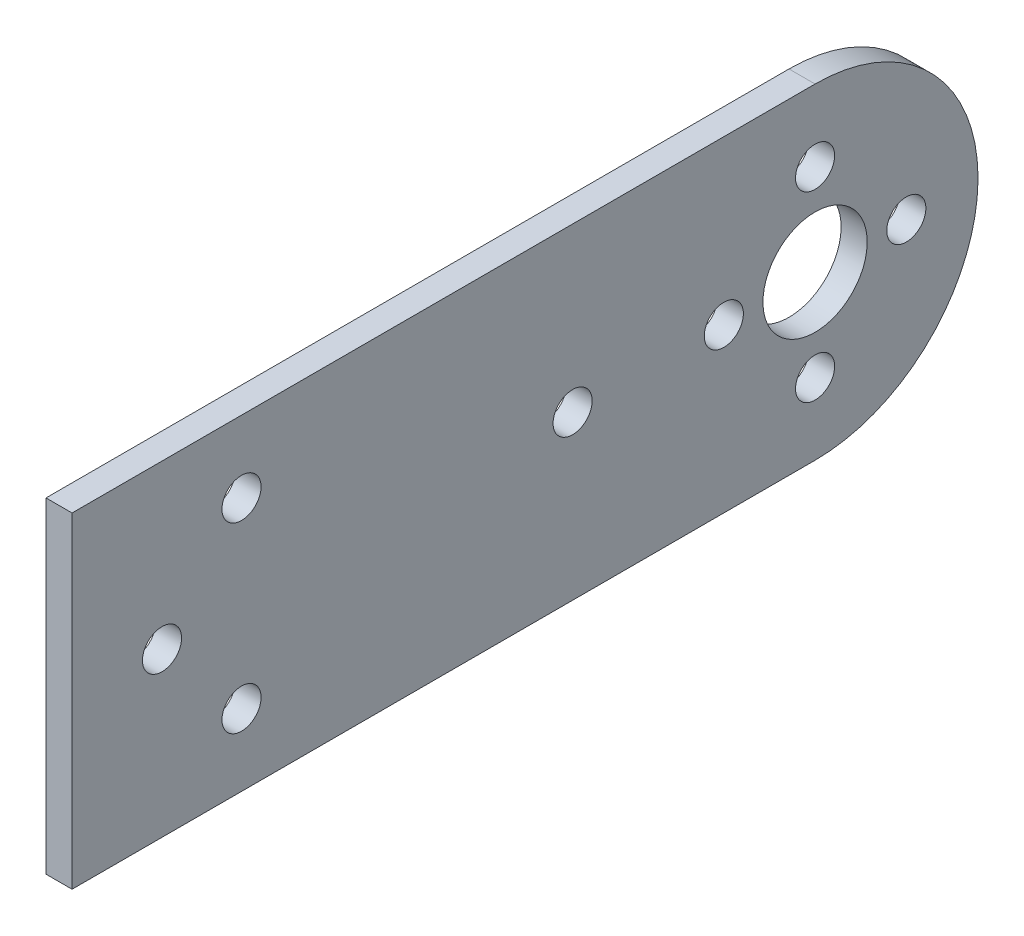
ISO-10303-21;
HEADER;
FILE_DESCRIPTION(('STEP AP214'),'2;1');
FILE_NAME('part.step','',(''),(''),'','','');
FILE_SCHEMA(('AUTOMOTIVE_DESIGN { 1 0 10303 214 1 1 1 1 }'));
ENDSEC;
DATA;
#1=APPLICATION_CONTEXT('core data for automotive mechanical design processes');
#2=APPLICATION_PROTOCOL_DEFINITION('international standard','automotive_design',2000,#1);
#3=PRODUCT_CONTEXT('',#1,'mechanical');
#4=PRODUCT('Part','Part','',(#3));
#5=PRODUCT_RELATED_PRODUCT_CATEGORY('part','',(#4));
#6=PRODUCT_DEFINITION_FORMATION('','',#4);
#7=PRODUCT_DEFINITION_CONTEXT('part definition',#1,'design');
#8=PRODUCT_DEFINITION('design','',#6,#7);
#9=PRODUCT_DEFINITION_SHAPE('','',#8);
#10=(LENGTH_UNIT() NAMED_UNIT(*) SI_UNIT(.MILLI.,.METRE.));
#11=(NAMED_UNIT(*) PLANE_ANGLE_UNIT() SI_UNIT($,.RADIAN.));
#12=(NAMED_UNIT(*) SI_UNIT($,.STERADIAN.) SOLID_ANGLE_UNIT());
#13=UNCERTAINTY_MEASURE_WITH_UNIT(LENGTH_MEASURE(1.E-05),#10,'distance_accuracy_value','');
#14=(GEOMETRIC_REPRESENTATION_CONTEXT(3) GLOBAL_UNCERTAINTY_ASSIGNED_CONTEXT((#13)) GLOBAL_UNIT_ASSIGNED_CONTEXT((#10,
#11,#12)) REPRESENTATION_CONTEXT('',''));
#15=CARTESIAN_POINT('',(0.,0.,0.));
#16=DIRECTION('',(0.,0.,1.));
#17=DIRECTION('',(1.,0.,0.));
#18=AXIS2_PLACEMENT_3D('',#15,#16,#17);
#19=CARTESIAN_POINT('',(0.999999999999999,12.5,69.5));
#20=DIRECTION('',(-1.,0.,0.));
#21=DIRECTION('',(0.,-1.,0.));
#22=AXIS2_PLACEMENT_3D('',#19,#20,#21);
#23=PLANE('',#22);
#24=CARTESIAN_POINT('',(1.,0.,62.6));
#25=DIRECTION('',(1.,0.,0.));
#26=DIRECTION('',(0.,1.,0.));
#27=AXIS2_PLACEMENT_3D('',#24,#25,#26);
#28=CIRCLE('',#27,1.5);
#29=CARTESIAN_POINT('',(1.,1.5,62.6));
#30=VERTEX_POINT('',#29);
#31=EDGE_CURVE('E238',#30,#30,#28,.T.);
#32=ORIENTED_EDGE('',*,*,#31,.F.);
#33=EDGE_LOOP('',(#32));
#34=FACE_BOUND('',#33,.T.);
#35=CARTESIAN_POINT('',(0.999999999999999,6.99999999999999,56.5));
#36=DIRECTION('',(1.,0.,0.));
#37=DIRECTION('',(0.,1.,0.));
#38=AXIS2_PLACEMENT_3D('',#35,#36,#37);
#39=CIRCLE('',#38,1.5);
#40=CARTESIAN_POINT('',(0.999999999999999,8.5,56.5));
#41=VERTEX_POINT('',#40);
#42=EDGE_CURVE('E326',#41,#41,#39,.T.);
#43=ORIENTED_EDGE('',*,*,#42,.F.);
#44=EDGE_LOOP('',(#43));
#45=FACE_BOUND('',#44,.T.);
#46=CARTESIAN_POINT('',(1.,-6.99999999999999,56.5));
#47=DIRECTION('',(1.,0.,0.));
#48=DIRECTION('',(0.,-1.,0.));
#49=AXIS2_PLACEMENT_3D('',#46,#47,#48);
#50=CIRCLE('',#49,1.5);
#51=CARTESIAN_POINT('',(1.,-8.5,56.5));
#52=VERTEX_POINT('',#51);
#53=EDGE_CURVE('E330',#52,#52,#50,.T.);
#54=ORIENTED_EDGE('',*,*,#53,.F.);
#55=EDGE_LOOP('',(#54));
#56=FACE_BOUND('',#55,.T.);
#57=CARTESIAN_POINT('',(1.,-7.,12.4990542607161));
#58=DIRECTION('',(1.,0.,0.));
#59=DIRECTION('',(0.,1.,0.));
#60=AXIS2_PLACEMENT_3D('',#57,#58,#59);
#61=CIRCLE('',#60,1.5);
#62=CARTESIAN_POINT('',(1.,-5.5,12.4990542607161));
#63=VERTEX_POINT('',#62);
#64=EDGE_CURVE('E264',#63,#63,#61,.T.);
#65=ORIENTED_EDGE('',*,*,#64,.F.);
#66=EDGE_LOOP('',(#65));
#67=FACE_BOUND('',#66,.T.);
#68=CARTESIAN_POINT('',(0.999999999999999,7.,12.4990542607161));
#69=DIRECTION('',(1.,0.,0.));
#70=DIRECTION('',(0.,1.,0.));
#71=AXIS2_PLACEMENT_3D('',#68,#69,#70);
#72=CIRCLE('',#71,1.5);
#73=CARTESIAN_POINT('',(0.999999999999999,8.5,12.4990542607161));
#74=VERTEX_POINT('',#73);
#75=EDGE_CURVE('E260',#74,#74,#72,.T.);
#76=ORIENTED_EDGE('',*,*,#75,.F.);
#77=EDGE_LOOP('',(#76));
#78=FACE_BOUND('',#77,.T.);
#79=CARTESIAN_POINT('',(1.,0.,31.0990542607161));
#80=DIRECTION('',(1.,0.,0.));
#81=DIRECTION('',(0.,1.,0.));
#82=AXIS2_PLACEMENT_3D('',#79,#80,#81);
#83=CIRCLE('',#82,1.5);
#84=CARTESIAN_POINT('',(1.,1.5,31.0990542607161));
#85=VERTEX_POINT('',#84);
#86=EDGE_CURVE('E245',#85,#85,#83,.T.);
#87=ORIENTED_EDGE('',*,*,#86,.F.);
#88=EDGE_LOOP('',(#87));
#89=FACE_BOUND('',#88,.T.);
#90=CARTESIAN_POINT('',(1.,0.,12.4990542607161));
#91=DIRECTION('',(1.,0.,0.));
#92=DIRECTION('',(0.,1.,0.));
#93=AXIS2_PLACEMENT_3D('',#90,#91,#92);
#94=CIRCLE('',#93,4.00000000000001);
#95=CARTESIAN_POINT('',(1.,4.00000000000001,12.4990542607161));
#96=VERTEX_POINT('',#95);
#97=EDGE_CURVE('E250',#96,#96,#94,.T.);
#98=ORIENTED_EDGE('',*,*,#97,.F.);
#99=EDGE_LOOP('',(#98));
#100=FACE_BOUND('',#99,.T.);
#101=CARTESIAN_POINT('',(1.,0.,19.4990542607161));
#102=DIRECTION('',(1.,0.,0.));
#103=DIRECTION('',(0.,1.,0.));
#104=AXIS2_PLACEMENT_3D('',#101,#102,#103);
#105=CIRCLE('',#104,1.5);
#106=CARTESIAN_POINT('',(1.,1.5,19.4990542607161));
#107=VERTEX_POINT('',#106);
#108=EDGE_CURVE('E256',#107,#107,#105,.T.);
#109=ORIENTED_EDGE('',*,*,#108,.F.);
#110=EDGE_LOOP('',(#109));
#111=FACE_BOUND('',#110,.T.);
#112=CARTESIAN_POINT('',(1.,0.,5.49905426071607));
#113=DIRECTION('',(1.,0.,0.));
#114=DIRECTION('',(0.,1.,0.));
#115=AXIS2_PLACEMENT_3D('',#112,#113,#114);
#116=CIRCLE('',#115,1.5);
#117=CARTESIAN_POINT('',(1.,1.5,5.49905426071607));
#118=VERTEX_POINT('',#117);
#119=EDGE_CURVE('E171',#118,#118,#116,.T.);
#120=ORIENTED_EDGE('',*,*,#119,.F.);
#121=EDGE_LOOP('',(#120));
#122=FACE_BOUND('',#121,.T.);
#123=CARTESIAN_POINT('',(1.,0.,12.4990542607161));
#124=DIRECTION('',(1.,0.,0.));
#125=DIRECTION('',(0.,1.,0.));
#126=AXIS2_PLACEMENT_3D('',#123,#124,#125);
#127=CIRCLE('',#126,12.5);
#128=CARTESIAN_POINT('',(1.,-12.5,12.4990542607161));
#129=VERTEX_POINT('',#128);
#130=CARTESIAN_POINT('',(1.,-0.153761463558061,0.));
#131=VERTEX_POINT('',#130);
#132=EDGE_CURVE('E162',#129,#131,#127,.T.);
#133=ORIENTED_EDGE('',*,*,#132,.T.);
#134=DIRECTION('',(0.,1.,0.));
#135=VECTOR('',#134,1.);
#136=CARTESIAN_POINT('',(0.999999999999999,12.5,0.));
#137=LINE('',#136,#135);
#138=CARTESIAN_POINT('',(1.,0.153761463558061,0.));
#139=VERTEX_POINT('',#138);
#140=EDGE_CURVE('E233',#131,#139,#137,.T.);
#141=ORIENTED_EDGE('',*,*,#140,.T.);
#142=CARTESIAN_POINT('',(1.,0.,12.4990542607161));
#143=DIRECTION('',(1.,0.,0.));
#144=DIRECTION('',(0.,1.,0.));
#145=AXIS2_PLACEMENT_3D('',#142,#143,#144);
#146=CIRCLE('',#145,12.5);
#147=CARTESIAN_POINT('',(0.999999999999999,12.5,12.4990542607161));
#148=VERTEX_POINT('',#147);
#149=EDGE_CURVE('E134',#139,#148,#146,.T.);
#150=ORIENTED_EDGE('',*,*,#149,.T.);
#151=DIRECTION('',(0.,0.,-1.));
#152=VECTOR('',#151,1.);
#153=CARTESIAN_POINT('',(0.999999999999999,12.5,69.5));
#154=LINE('',#153,#152);
#155=CARTESIAN_POINT('',(0.999999999999999,12.5,69.5));
#156=VERTEX_POINT('',#155);
#157=EDGE_CURVE('E203',#156,#148,#154,.T.);
#158=ORIENTED_EDGE('',*,*,#157,.F.);
#159=DIRECTION('',(0.,1.,0.));
#160=VECTOR('',#159,1.);
#161=CARTESIAN_POINT('',(0.999999999999999,12.5,69.5));
#162=LINE('',#161,#160);
#163=CARTESIAN_POINT('',(1.,-12.5,69.5));
#164=VERTEX_POINT('',#163);
#165=EDGE_CURVE('E186',#164,#156,#162,.T.);
#166=ORIENTED_EDGE('',*,*,#165,.F.);
#167=DIRECTION('',(0.,0.,-1.));
#168=VECTOR('',#167,1.);
#169=CARTESIAN_POINT('',(1.,-12.5,69.5));
#170=LINE('',#169,#168);
#171=EDGE_CURVE('E178',#164,#129,#170,.T.);
#172=ORIENTED_EDGE('',*,*,#171,.T.);
#173=EDGE_LOOP('',(#133,#141,#150,#158,#166,#172));
#174=FACE_BOUND('',#173,.T.);
#175=ADVANCED_FACE('F110',(#34,#45,#56,#67,#78,#89,#100,#111,#122,#174),#23,.F.);
#176=CARTESIAN_POINT('',(-1.,12.5,69.5));
#177=DIRECTION('',(0.,-1.,0.));
#178=DIRECTION('',(0.,0.,-1.));
#179=AXIS2_PLACEMENT_3D('',#176,#177,#178);
#180=PLANE('',#179);
#181=DIRECTION('',(1.,0.,0.));
#182=VECTOR('',#181,1.);
#183=CARTESIAN_POINT('',(-68.5,12.5,12.4990542607161));
#184=LINE('',#183,#182);
#185=CARTESIAN_POINT('',(-1.,12.5,12.4990542607161));
#186=VERTEX_POINT('',#185);
#187=EDGE_CURVE('E273',#186,#148,#184,.T.);
#188=ORIENTED_EDGE('',*,*,#187,.F.);
#189=DIRECTION('',(0.,0.,-1.));
#190=VECTOR('',#189,1.);
#191=CARTESIAN_POINT('',(-1.,12.5,69.5));
#192=LINE('',#191,#190);
#193=CARTESIAN_POINT('',(-1.,12.5,69.5));
#194=VERTEX_POINT('',#193);
#195=EDGE_CURVE('E192',#194,#186,#192,.T.);
#196=ORIENTED_EDGE('',*,*,#195,.F.);
#197=DIRECTION('',(-1.,0.,0.));
#198=VECTOR('',#197,1.);
#199=CARTESIAN_POINT('',(-1.,12.5,69.5));
#200=LINE('',#199,#198);
#201=EDGE_CURVE('E283',#156,#194,#200,.T.);
#202=ORIENTED_EDGE('',*,*,#201,.F.);
#203=ORIENTED_EDGE('',*,*,#157,.T.);
#204=EDGE_LOOP('',(#188,#196,#202,#203));
#205=FACE_BOUND('',#204,.T.);
#206=ADVANCED_FACE('F300',(#205),#180,.F.);
#207=CARTESIAN_POINT('',(-1.,12.5,69.5));
#208=DIRECTION('',(1.,0.,0.));
#209=DIRECTION('',(0.,1.,0.));
#210=AXIS2_PLACEMENT_3D('',#207,#208,#209);
#211=PLANE('',#210);
#212=CARTESIAN_POINT('',(-0.999999999999999,0.,62.6));
#213=DIRECTION('',(1.,0.,0.));
#214=DIRECTION('',(0.,1.,0.));
#215=AXIS2_PLACEMENT_3D('',#212,#213,#214);
#216=CIRCLE('',#215,1.5);
#217=CARTESIAN_POINT('',(-0.999999999999999,1.5,62.6));
#218=VERTEX_POINT('',#217);
#219=EDGE_CURVE('E113',#218,#218,#216,.T.);
#220=ORIENTED_EDGE('',*,*,#219,.T.);
#221=EDGE_LOOP('',(#220));
#222=FACE_BOUND('',#221,.T.);
#223=CARTESIAN_POINT('',(-1.,6.99999999999999,56.5));
#224=DIRECTION('',(1.,0.,0.));
#225=DIRECTION('',(0.,1.,0.));
#226=AXIS2_PLACEMENT_3D('',#223,#224,#225);
#227=CIRCLE('',#226,1.5);
#228=CARTESIAN_POINT('',(-1.,8.5,56.5));
#229=VERTEX_POINT('',#228);
#230=EDGE_CURVE('E237',#229,#229,#227,.T.);
#231=ORIENTED_EDGE('',*,*,#230,.T.);
#232=EDGE_LOOP('',(#231));
#233=FACE_BOUND('',#232,.T.);
#234=CARTESIAN_POINT('',(-0.999999999999999,-6.99999999999999,56.5));
#235=DIRECTION('',(1.,0.,0.));
#236=DIRECTION('',(0.,1.,0.));
#237=AXIS2_PLACEMENT_3D('',#234,#235,#236);
#238=CIRCLE('',#237,1.5);
#239=CARTESIAN_POINT('',(-0.999999999999999,-5.49999999999999,56.5));
#240=VERTEX_POINT('',#239);
#241=EDGE_CURVE('E234',#240,#240,#238,.T.);
#242=ORIENTED_EDGE('',*,*,#241,.T.);
#243=EDGE_LOOP('',(#242));
#244=FACE_BOUND('',#243,.T.);
#245=CARTESIAN_POINT('',(-1.,-7.,12.4990542607161));
#246=DIRECTION('',(1.,0.,0.));
#247=DIRECTION('',(0.,1.,0.));
#248=AXIS2_PLACEMENT_3D('',#245,#246,#247);
#249=CIRCLE('',#248,1.5);
#250=CARTESIAN_POINT('',(-1.,-5.5,12.4990542607161));
#251=VERTEX_POINT('',#250);
#252=EDGE_CURVE('E229',#251,#251,#249,.T.);
#253=ORIENTED_EDGE('',*,*,#252,.T.);
#254=EDGE_LOOP('',(#253));
#255=FACE_BOUND('',#254,.T.);
#256=CARTESIAN_POINT('',(-1.,7.,12.4990542607161));
#257=DIRECTION('',(1.,0.,0.));
#258=DIRECTION('',(0.,1.,0.));
#259=AXIS2_PLACEMENT_3D('',#256,#257,#258);
#260=CIRCLE('',#259,1.5);
#261=CARTESIAN_POINT('',(-1.,8.5,12.4990542607161));
#262=VERTEX_POINT('',#261);
#263=EDGE_CURVE('E225',#262,#262,#260,.T.);
#264=ORIENTED_EDGE('',*,*,#263,.T.);
#265=EDGE_LOOP('',(#264));
#266=FACE_BOUND('',#265,.T.);
#267=CARTESIAN_POINT('',(-1.,0.,31.0990542607161));
#268=DIRECTION('',(1.,0.,0.));
#269=DIRECTION('',(0.,1.,0.));
#270=AXIS2_PLACEMENT_3D('',#267,#268,#269);
#271=CIRCLE('',#270,1.5);
#272=CARTESIAN_POINT('',(-1.,1.5,31.0990542607161));
#273=VERTEX_POINT('',#272);
#274=EDGE_CURVE('E209',#273,#273,#271,.T.);
#275=ORIENTED_EDGE('',*,*,#274,.T.);
#276=EDGE_LOOP('',(#275));
#277=FACE_BOUND('',#276,.T.);
#278=CARTESIAN_POINT('',(-1.,0.,12.4990542607161));
#279=DIRECTION('',(1.,0.,0.));
#280=DIRECTION('',(0.,1.,0.));
#281=AXIS2_PLACEMENT_3D('',#278,#279,#280);
#282=CIRCLE('',#281,4.00000000000001);
#283=CARTESIAN_POINT('',(-1.,4.00000000000001,12.4990542607161));
#284=VERTEX_POINT('',#283);
#285=EDGE_CURVE('E213',#284,#284,#282,.T.);
#286=ORIENTED_EDGE('',*,*,#285,.T.);
#287=EDGE_LOOP('',(#286));
#288=FACE_BOUND('',#287,.T.);
#289=CARTESIAN_POINT('',(-1.,0.,19.4990542607161));
#290=DIRECTION('',(1.,0.,0.));
#291=DIRECTION('',(0.,1.,0.));
#292=AXIS2_PLACEMENT_3D('',#289,#290,#291);
#293=CIRCLE('',#292,1.5);
#294=CARTESIAN_POINT('',(-1.,1.5,19.4990542607161));
#295=VERTEX_POINT('',#294);
#296=EDGE_CURVE('E217',#295,#295,#293,.T.);
#297=ORIENTED_EDGE('',*,*,#296,.T.);
#298=EDGE_LOOP('',(#297));
#299=FACE_BOUND('',#298,.T.);
#300=CARTESIAN_POINT('',(-1.,0.,5.49905426071607));
#301=DIRECTION('',(1.,0.,0.));
#302=DIRECTION('',(0.,1.,0.));
#303=AXIS2_PLACEMENT_3D('',#300,#301,#302);
#304=CIRCLE('',#303,1.5);
#305=CARTESIAN_POINT('',(-1.,1.5,5.49905426071607));
#306=VERTEX_POINT('',#305);
#307=EDGE_CURVE('E221',#306,#306,#304,.T.);
#308=ORIENTED_EDGE('',*,*,#307,.T.);
#309=EDGE_LOOP('',(#308));
#310=FACE_BOUND('',#309,.T.);
#311=CARTESIAN_POINT('',(-1.,0.,12.4990542607161));
#312=DIRECTION('',(1.,0.,0.));
#313=DIRECTION('',(0.,1.,0.));
#314=AXIS2_PLACEMENT_3D('',#311,#312,#313);
#315=CIRCLE('',#314,12.5);
#316=CARTESIAN_POINT('',(-1.,-12.5,12.4990542607161));
#317=VERTEX_POINT('',#316);
#318=CARTESIAN_POINT('',(-1.,-0.153761463558061,0.));
#319=VERTEX_POINT('',#318);
#320=EDGE_CURVE('E126',#317,#319,#315,.T.);
#321=ORIENTED_EDGE('',*,*,#320,.F.);
#322=DIRECTION('',(0.,0.,-1.));
#323=VECTOR('',#322,1.);
#324=CARTESIAN_POINT('',(-0.999999999999999,-12.5,69.5));
#325=LINE('',#324,#323);
#326=CARTESIAN_POINT('',(-0.999999999999999,-12.5,69.5));
#327=VERTEX_POINT('',#326);
#328=EDGE_CURVE('E181',#327,#317,#325,.T.);
#329=ORIENTED_EDGE('',*,*,#328,.F.);
#330=DIRECTION('',(0.,-1.,0.));
#331=VECTOR('',#330,1.);
#332=CARTESIAN_POINT('',(-1.,12.5,69.5));
#333=LINE('',#332,#331);
#334=EDGE_CURVE('E194',#194,#327,#333,.T.);
#335=ORIENTED_EDGE('',*,*,#334,.F.);
#336=ORIENTED_EDGE('',*,*,#195,.T.);
#337=CARTESIAN_POINT('',(-1.,0.,12.4990542607161));
#338=DIRECTION('',(1.,0.,0.));
#339=DIRECTION('',(0.,1.,0.));
#340=AXIS2_PLACEMENT_3D('',#337,#338,#339);
#341=CIRCLE('',#340,12.5);
#342=CARTESIAN_POINT('',(-1.,0.153761463558061,0.));
#343=VERTEX_POINT('',#342);
#344=EDGE_CURVE('E276',#343,#186,#341,.T.);
#345=ORIENTED_EDGE('',*,*,#344,.F.);
#346=DIRECTION('',(0.,-1.,0.));
#347=VECTOR('',#346,1.);
#348=CARTESIAN_POINT('',(-1.,12.5,0.));
#349=LINE('',#348,#347);
#350=EDGE_CURVE('E197',#343,#319,#349,.T.);
#351=ORIENTED_EDGE('',*,*,#350,.T.);
#352=EDGE_LOOP('',(#321,#329,#335,#336,#345,#351));
#353=FACE_BOUND('',#352,.T.);
#354=ADVANCED_FACE('F293',(#222,#233,#244,#255,#266,#277,#288,#299,#310,#353),#211,.F.);
#355=CARTESIAN_POINT('',(0.,0.,0.));
#356=DIRECTION('',(0.,0.,1.));
#357=DIRECTION('',(1.,0.,0.));
#358=AXIS2_PLACEMENT_3D('',#355,#356,#357);
#359=PLANE('',#358);
#360=DIRECTION('',(1.,0.,0.));
#361=VECTOR('',#360,1.);
#362=CARTESIAN_POINT('',(-68.5,-0.153761463558069,0.));
#363=LINE('',#362,#361);
#364=EDGE_CURVE('E12',#319,#131,#363,.T.);
#365=ORIENTED_EDGE('',*,*,#364,.F.);
#366=ORIENTED_EDGE('',*,*,#350,.F.);
#367=DIRECTION('',(1.,0.,0.));
#368=VECTOR('',#367,1.);
#369=CARTESIAN_POINT('',(-68.5,0.153761463558053,0.));
#370=LINE('',#369,#368);
#371=EDGE_CURVE('E119',#139,#343,#370,.F.);
#372=ORIENTED_EDGE('',*,*,#371,.F.);
#373=ORIENTED_EDGE('',*,*,#140,.F.);
#374=EDGE_LOOP('',(#365,#366,#372,#373));
#375=FACE_BOUND('',#374,.T.);
#376=ADVANCED_FACE('F295',(#375),#359,.F.);
#377=CARTESIAN_POINT('',(-0.999999999999999,-12.5,69.5));
#378=DIRECTION('',(0.,1.,0.));
#379=DIRECTION('',(0.,0.,1.));
#380=AXIS2_PLACEMENT_3D('',#377,#378,#379);
#381=PLANE('',#380);
#382=ORIENTED_EDGE('',*,*,#328,.T.);
#383=DIRECTION('',(1.,0.,0.));
#384=VECTOR('',#383,1.);
#385=CARTESIAN_POINT('',(-68.5,-12.5,12.4990542607161));
#386=LINE('',#385,#384);
#387=EDGE_CURVE('E165',#317,#129,#386,.T.);
#388=ORIENTED_EDGE('',*,*,#387,.T.);
#389=ORIENTED_EDGE('',*,*,#171,.F.);
#390=DIRECTION('',(1.,0.,0.));
#391=VECTOR('',#390,1.);
#392=CARTESIAN_POINT('',(-0.999999999999999,-12.5,69.5));
#393=LINE('',#392,#391);
#394=EDGE_CURVE('E188',#327,#164,#393,.T.);
#395=ORIENTED_EDGE('',*,*,#394,.F.);
#396=EDGE_LOOP('',(#382,#388,#389,#395));
#397=FACE_BOUND('',#396,.T.);
#398=ADVANCED_FACE('F176',(#397),#381,.F.);
#399=CARTESIAN_POINT('',(0.,0.,69.5));
#400=DIRECTION('',(0.,0.,1.));
#401=DIRECTION('',(1.,0.,0.));
#402=AXIS2_PLACEMENT_3D('',#399,#400,#401);
#403=PLANE('',#402);
#404=ORIENTED_EDGE('',*,*,#165,.T.);
#405=ORIENTED_EDGE('',*,*,#201,.T.);
#406=ORIENTED_EDGE('',*,*,#334,.T.);
#407=ORIENTED_EDGE('',*,*,#394,.T.);
#408=EDGE_LOOP('',(#404,#405,#406,#407));
#409=FACE_BOUND('',#408,.T.);
#410=ADVANCED_FACE('F303',(#409),#403,.T.);
#411=CARTESIAN_POINT('',(-68.5,0.,12.4990542607161));
#412=DIRECTION('',(1.,0.,0.));
#413=DIRECTION('',(0.,1.,0.));
#414=AXIS2_PLACEMENT_3D('',#411,#412,#413);
#415=CYLINDRICAL_SURFACE('',#414,12.5);
#416=ORIENTED_EDGE('',*,*,#344,.T.);
#417=ORIENTED_EDGE('',*,*,#187,.T.);
#418=ORIENTED_EDGE('',*,*,#149,.F.);
#419=ORIENTED_EDGE('',*,*,#371,.T.);
#420=EDGE_LOOP('',(#416,#417,#418,#419));
#421=FACE_BOUND('',#420,.T.);
#422=ADVANCED_FACE('F296',(#421),#415,.T.);
#423=CARTESIAN_POINT('',(-68.5,0.,12.4990542607161));
#424=DIRECTION('',(1.,0.,0.));
#425=DIRECTION('',(0.,1.,0.));
#426=AXIS2_PLACEMENT_3D('',#423,#424,#425);
#427=CYLINDRICAL_SURFACE('',#426,12.5);
#428=ORIENTED_EDGE('',*,*,#320,.T.);
#429=ORIENTED_EDGE('',*,*,#364,.T.);
#430=ORIENTED_EDGE('',*,*,#132,.F.);
#431=ORIENTED_EDGE('',*,*,#387,.F.);
#432=EDGE_LOOP('',(#428,#429,#430,#431));
#433=FACE_BOUND('',#432,.T.);
#434=ADVANCED_FACE('F164',(#433),#427,.T.);
#435=CARTESIAN_POINT('',(-68.5,0.,31.0990542607161));
#436=DIRECTION('',(1.,0.,0.));
#437=DIRECTION('',(0.,1.,0.));
#438=AXIS2_PLACEMENT_3D('',#435,#436,#437);
#439=CYLINDRICAL_SURFACE('',#438,1.5);
#440=ORIENTED_EDGE('',*,*,#86,.T.);
#441=EDGE_LOOP('',(#440));
#442=FACE_BOUND('',#441,.T.);
#443=ORIENTED_EDGE('',*,*,#274,.F.);
#444=EDGE_LOOP('',(#443));
#445=FACE_BOUND('',#444,.T.);
#446=ADVANCED_FACE('F376',(#442,#445),#439,.F.);
#447=CARTESIAN_POINT('',(-68.5,0.,12.4990542607161));
#448=DIRECTION('',(1.,0.,0.));
#449=DIRECTION('',(0.,1.,0.));
#450=AXIS2_PLACEMENT_3D('',#447,#448,#449);
#451=CYLINDRICAL_SURFACE('',#450,4.00000000000001);
#452=ORIENTED_EDGE('',*,*,#97,.T.);
#453=EDGE_LOOP('',(#452));
#454=FACE_BOUND('',#453,.T.);
#455=ORIENTED_EDGE('',*,*,#285,.F.);
#456=EDGE_LOOP('',(#455));
#457=FACE_BOUND('',#456,.T.);
#458=ADVANCED_FACE('F370',(#454,#457),#451,.F.);
#459=CARTESIAN_POINT('',(-68.5,0.,19.4990542607161));
#460=DIRECTION('',(1.,0.,0.));
#461=DIRECTION('',(0.,1.,0.));
#462=AXIS2_PLACEMENT_3D('',#459,#460,#461);
#463=CYLINDRICAL_SURFACE('',#462,1.5);
#464=ORIENTED_EDGE('',*,*,#108,.T.);
#465=EDGE_LOOP('',(#464));
#466=FACE_BOUND('',#465,.T.);
#467=ORIENTED_EDGE('',*,*,#296,.F.);
#468=EDGE_LOOP('',(#467));
#469=FACE_BOUND('',#468,.T.);
#470=ADVANCED_FACE('F347',(#466,#469),#463,.F.);
#471=CARTESIAN_POINT('',(-68.5,0.,5.49905426071607));
#472=DIRECTION('',(1.,0.,0.));
#473=DIRECTION('',(0.,1.,0.));
#474=AXIS2_PLACEMENT_3D('',#471,#472,#473);
#475=CYLINDRICAL_SURFACE('',#474,1.5);
#476=ORIENTED_EDGE('',*,*,#119,.T.);
#477=EDGE_LOOP('',(#476));
#478=FACE_BOUND('',#477,.T.);
#479=ORIENTED_EDGE('',*,*,#307,.F.);
#480=EDGE_LOOP('',(#479));
#481=FACE_BOUND('',#480,.T.);
#482=ADVANCED_FACE('F343',(#478,#481),#475,.F.);
#483=CARTESIAN_POINT('',(-68.5,6.99999999999999,12.4990542607161));
#484=DIRECTION('',(1.,0.,0.));
#485=DIRECTION('',(0.,1.,0.));
#486=AXIS2_PLACEMENT_3D('',#483,#484,#485);
#487=CYLINDRICAL_SURFACE('',#486,1.5);
#488=ORIENTED_EDGE('',*,*,#75,.T.);
#489=EDGE_LOOP('',(#488));
#490=FACE_BOUND('',#489,.T.);
#491=ORIENTED_EDGE('',*,*,#263,.F.);
#492=EDGE_LOOP('',(#491));
#493=FACE_BOUND('',#492,.T.);
#494=ADVANCED_FACE('F346',(#490,#493),#487,.F.);
#495=CARTESIAN_POINT('',(-68.5,-7.00000000000001,12.4990542607161));
#496=DIRECTION('',(1.,0.,0.));
#497=DIRECTION('',(0.,1.,0.));
#498=AXIS2_PLACEMENT_3D('',#495,#496,#497);
#499=CYLINDRICAL_SURFACE('',#498,1.5);
#500=ORIENTED_EDGE('',*,*,#64,.T.);
#501=EDGE_LOOP('',(#500));
#502=FACE_BOUND('',#501,.T.);
#503=ORIENTED_EDGE('',*,*,#252,.F.);
#504=EDGE_LOOP('',(#503));
#505=FACE_BOUND('',#504,.T.);
#506=ADVANCED_FACE('F387',(#502,#505),#499,.F.);
#507=CARTESIAN_POINT('',(-9.,-6.99999999999999,56.5));
#508=DIRECTION('',(1.,0.,0.));
#509=DIRECTION('',(0.,1.,0.));
#510=AXIS2_PLACEMENT_3D('',#507,#508,#509);
#511=CYLINDRICAL_SURFACE('',#510,1.5);
#512=ORIENTED_EDGE('',*,*,#53,.T.);
#513=EDGE_LOOP('',(#512));
#514=FACE_BOUND('',#513,.T.);
#515=ORIENTED_EDGE('',*,*,#241,.F.);
#516=EDGE_LOOP('',(#515));
#517=FACE_BOUND('',#516,.T.);
#518=ADVANCED_FACE('F380',(#514,#517),#511,.F.);
#519=CARTESIAN_POINT('',(-9.,6.99999999999999,56.5));
#520=DIRECTION('',(1.,0.,0.));
#521=DIRECTION('',(0.,1.,0.));
#522=AXIS2_PLACEMENT_3D('',#519,#520,#521);
#523=CYLINDRICAL_SURFACE('',#522,1.5);
#524=ORIENTED_EDGE('',*,*,#42,.T.);
#525=EDGE_LOOP('',(#524));
#526=FACE_BOUND('',#525,.T.);
#527=ORIENTED_EDGE('',*,*,#230,.F.);
#528=EDGE_LOOP('',(#527));
#529=FACE_BOUND('',#528,.T.);
#530=ADVANCED_FACE('F434',(#526,#529),#523,.F.);
#531=CARTESIAN_POINT('',(-9.,0.,62.6));
#532=DIRECTION('',(1.,0.,0.));
#533=DIRECTION('',(0.,1.,0.));
#534=AXIS2_PLACEMENT_3D('',#531,#532,#533);
#535=CYLINDRICAL_SURFACE('',#534,1.5);
#536=ORIENTED_EDGE('',*,*,#31,.T.);
#537=EDGE_LOOP('',(#536));
#538=FACE_BOUND('',#537,.T.);
#539=ORIENTED_EDGE('',*,*,#219,.F.);
#540=EDGE_LOOP('',(#539));
#541=FACE_BOUND('',#540,.T.);
#542=ADVANCED_FACE('F440',(#538,#541),#535,.F.);
#543=CLOSED_SHELL('',(#175,#206,#354,#376,#398,#410,#422,#434,#446,#458,#470,#482,#494,#506,
#518,#530,#542));
#544=MANIFOLD_SOLID_BREP('B2',#543);
#545=ADVANCED_BREP_SHAPE_REPRESENTATION('',(#18,#544),#14);
#546=SHAPE_DEFINITION_REPRESENTATION(#9,#545);
ENDSEC;
END-ISO-10303-21;
